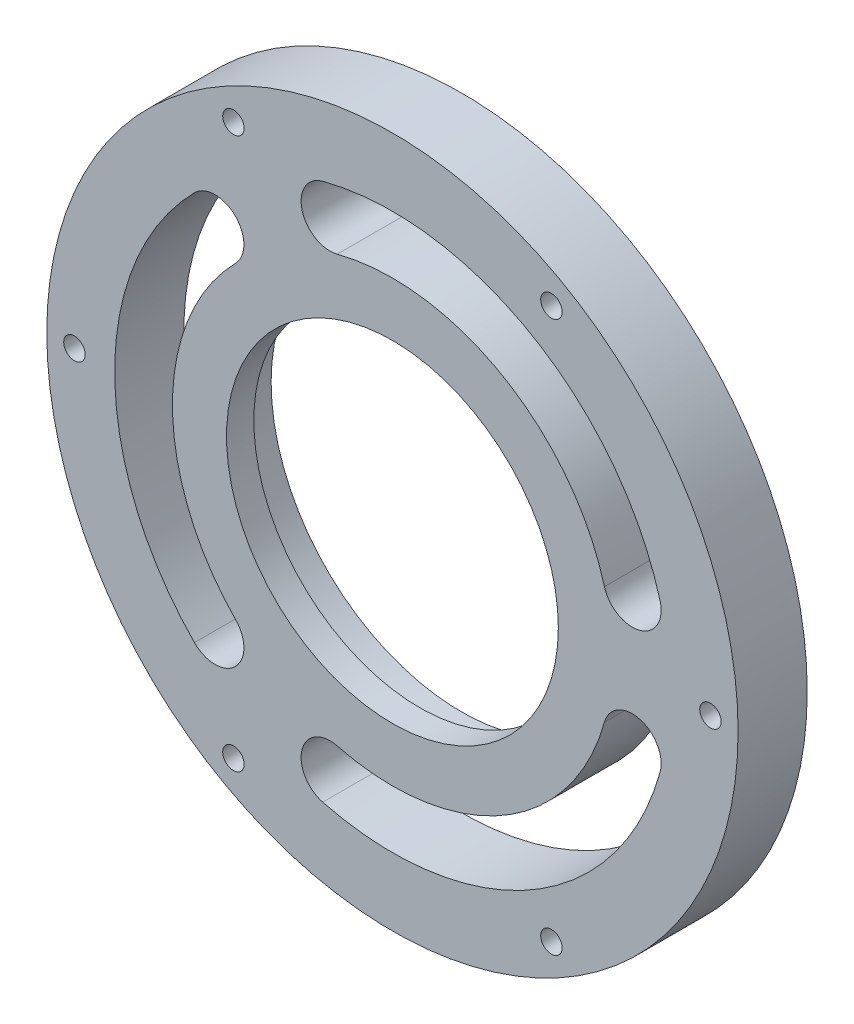
ISO-10303-21;
HEADER;
FILE_DESCRIPTION(('STEP AP214'),'2;1');
FILE_NAME('part.step','',(''),(''),'','','');
FILE_SCHEMA(('AUTOMOTIVE_DESIGN { 1 0 10303 214 1 1 1 1 }'));
ENDSEC;
DATA;
#1=APPLICATION_CONTEXT('core data for automotive mechanical design processes');
#2=APPLICATION_PROTOCOL_DEFINITION('international standard','automotive_design',2000,#1);
#3=PRODUCT_CONTEXT('',#1,'mechanical');
#4=PRODUCT('Part','Part','',(#3));
#5=PRODUCT_RELATED_PRODUCT_CATEGORY('part','',(#4));
#6=PRODUCT_DEFINITION_FORMATION('','',#4);
#7=PRODUCT_DEFINITION_CONTEXT('part definition',#1,'design');
#8=PRODUCT_DEFINITION('design','',#6,#7);
#9=PRODUCT_DEFINITION_SHAPE('','',#8);
#10=(LENGTH_UNIT() NAMED_UNIT(*) SI_UNIT(.MILLI.,.METRE.));
#11=(NAMED_UNIT(*) PLANE_ANGLE_UNIT() SI_UNIT($,.RADIAN.));
#12=(NAMED_UNIT(*) SI_UNIT($,.STERADIAN.) SOLID_ANGLE_UNIT());
#13=UNCERTAINTY_MEASURE_WITH_UNIT(LENGTH_MEASURE(1.E-05),#10,'distance_accuracy_value','');
#14=(GEOMETRIC_REPRESENTATION_CONTEXT(3) GLOBAL_UNCERTAINTY_ASSIGNED_CONTEXT((#13)) GLOBAL_UNIT_ASSIGNED_CONTEXT((#10,
#11,#12)) REPRESENTATION_CONTEXT('',''));
#15=CARTESIAN_POINT('',(0.,0.,0.));
#16=DIRECTION('',(0.,0.,1.));
#17=DIRECTION('',(1.,0.,0.));
#18=AXIS2_PLACEMENT_3D('',#15,#16,#17);
#19=CARTESIAN_POINT('',(0.,0.,0.));
#20=DIRECTION('',(0.,0.,1.));
#21=DIRECTION('',(1.,0.,0.));
#22=AXIS2_PLACEMENT_3D('',#19,#20,#21);
#23=CYLINDRICAL_SURFACE('',#22,27.55);
#24=CARTESIAN_POINT('',(0.,0.,0.));
#25=DIRECTION('',(0.,0.,1.));
#26=DIRECTION('',(1.,0.,0.));
#27=AXIS2_PLACEMENT_3D('',#24,#25,#26);
#28=CIRCLE('',#27,27.55);
#29=CARTESIAN_POINT('',(27.55,0.,0.));
#30=VERTEX_POINT('',#29);
#31=EDGE_CURVE('E232',#30,#30,#28,.T.);
#32=ORIENTED_EDGE('',*,*,#31,.F.);
#33=EDGE_LOOP('',(#32));
#34=FACE_BOUND('',#33,.T.);
#35=CARTESIAN_POINT('',(0.,0.,6.05));
#36=DIRECTION('',(0.,0.,1.));
#37=DIRECTION('',(1.,0.,0.));
#38=AXIS2_PLACEMENT_3D('',#35,#36,#37);
#39=CIRCLE('',#38,27.55);
#40=CARTESIAN_POINT('',(27.55,0.,6.05));
#41=VERTEX_POINT('',#40);
#42=EDGE_CURVE('E11',#41,#41,#39,.F.);
#43=ORIENTED_EDGE('',*,*,#42,.F.);
#44=EDGE_LOOP('',(#43));
#45=FACE_BOUND('',#44,.T.);
#46=ADVANCED_FACE('F43',(#34,#45),#23,.F.);
#47=CARTESIAN_POINT('',(0.,0.,10.));
#48=DIRECTION('',(0.,0.,1.));
#49=DIRECTION('',(1.,0.,0.));
#50=AXIS2_PLACEMENT_3D('',#47,#48,#49);
#51=PLANE('',#50);
#52=CARTESIAN_POINT('',(34.6965450819365,-9.59946661940883,10.));
#53=DIRECTION('',(0.,0.,-1.));
#54=DIRECTION('',(-1.,0.,0.));
#55=AXIS2_PLACEMENT_3D('',#52,#53,#54);
#56=CIRCLE('',#55,4.17775566612985);
#57=CARTESIAN_POINT('',(30.6700537538479,-8.48546033993495,10.));
#58=VERTEX_POINT('',#57);
#59=CARTESIAN_POINT('',(38.7230364100252,-10.7134728988827,10.));
#60=VERTEX_POINT('',#59);
#61=EDGE_CURVE('E190',#58,#60,#56,.T.);
#62=ORIENTED_EDGE('',*,*,#61,.T.);
#63=CARTESIAN_POINT('',(0.,0.,10.));
#64=DIRECTION('',(0.,0.,-1.));
#65=DIRECTION('',(-1.,0.,0.));
#66=AXIS2_PLACEMENT_3D('',#63,#64,#65);
#67=CIRCLE('',#66,40.1777556661298);
#68=CARTESIAN_POINT('',(-10.083378511824,-38.8918696921929,10.));
#69=VERTEX_POINT('',#68);
#70=EDGE_CURVE('E200',#60,#69,#67,.T.);
#71=ORIENTED_EDGE('',*,*,#70,.T.);
#72=CARTESIAN_POINT('',(-9.03489058577944,-34.8478227742135,10.));
#73=DIRECTION('',(0.,0.,-1.));
#74=DIRECTION('',(-1.,0.,0.));
#75=AXIS2_PLACEMENT_3D('',#72,#73,#74);
#76=CIRCLE('',#75,4.17775566612984);
#77=CARTESIAN_POINT('',(-7.98640265973491,-30.8037758562341,10.));
#78=VERTEX_POINT('',#77);
#79=EDGE_CURVE('E59',#69,#78,#76,.T.);
#80=ORIENTED_EDGE('',*,*,#79,.T.);
#81=CARTESIAN_POINT('',(0.,0.,10.));
#82=DIRECTION('',(0.,0.,1.));
#83=DIRECTION('',(-1.,0.,0.));
#84=AXIS2_PLACEMENT_3D('',#81,#82,#83);
#85=CIRCLE('',#84,31.8222443338702);
#86=EDGE_CURVE('E176',#78,#58,#85,.T.);
#87=ORIENTED_EDGE('',*,*,#86,.T.);
#88=EDGE_LOOP('',(#62,#71,#80,#87));
#89=FACE_BOUND('',#88,.T.);
#90=CARTESIAN_POINT('',(-25.6616544961571,-25.2483561548046,10.));
#91=DIRECTION('',(0.,0.,-1.));
#92=DIRECTION('',(-1.,0.,0.));
#93=AXIS2_PLACEMENT_3D('',#90,#91,#92);
#94=CIRCLE('',#93,4.17775566612984);
#95=CARTESIAN_POINT('',(-22.683651094113,-22.3183155162991,10.));
#96=VERTEX_POINT('',#95);
#97=CARTESIAN_POINT('',(-28.6396578982011,-28.1783967933102,10.));
#98=VERTEX_POINT('',#97);
#99=EDGE_CURVE('E137',#96,#98,#94,.T.);
#100=ORIENTED_EDGE('',*,*,#99,.T.);
#101=CARTESIAN_POINT('',(0.,0.,10.));
#102=DIRECTION('',(0.,0.,-1.));
#103=DIRECTION('',(-1.,0.,0.));
#104=AXIS2_PLACEMENT_3D('',#101,#102,#103);
#105=CIRCLE('',#104,40.1777556661298);
#106=CARTESIAN_POINT('',(-28.6396578982012,28.1783967933102,10.));
#107=VERTEX_POINT('',#106);
#108=EDGE_CURVE('E169',#98,#107,#105,.T.);
#109=ORIENTED_EDGE('',*,*,#108,.T.);
#110=CARTESIAN_POINT('',(-25.6616544961571,25.2483561548046,10.));
#111=DIRECTION('',(0.,0.,-1.));
#112=DIRECTION('',(-1.,0.,0.));
#113=AXIS2_PLACEMENT_3D('',#110,#111,#112);
#114=CIRCLE('',#113,4.17775566612984);
#115=CARTESIAN_POINT('',(-22.683651094113,22.3183155162991,10.));
#116=VERTEX_POINT('',#115);
#117=EDGE_CURVE('E66',#107,#116,#114,.T.);
#118=ORIENTED_EDGE('',*,*,#117,.T.);
#119=CARTESIAN_POINT('',(0.,0.,10.));
#120=DIRECTION('',(0.,0.,1.));
#121=DIRECTION('',(-1.,0.,0.));
#122=AXIS2_PLACEMENT_3D('',#119,#120,#121);
#123=CIRCLE('',#122,31.8222443338701);
#124=EDGE_CURVE('E164',#116,#96,#123,.T.);
#125=ORIENTED_EDGE('',*,*,#124,.T.);
#126=EDGE_LOOP('',(#100,#109,#118,#125));
#127=FACE_BOUND('',#126,.T.);
#128=CARTESIAN_POINT('',(-9.03489058577949,34.8478227742135,10.));
#129=DIRECTION('',(0.,0.,-1.));
#130=DIRECTION('',(-1.,0.,0.));
#131=AXIS2_PLACEMENT_3D('',#128,#129,#130);
#132=CIRCLE('',#131,4.17775566612985);
#133=CARTESIAN_POINT('',(-7.98640265973494,30.8037758562341,10.));
#134=VERTEX_POINT('',#133);
#135=CARTESIAN_POINT('',(-10.083378511824,38.8918696921929,10.));
#136=VERTEX_POINT('',#135);
#137=EDGE_CURVE('E205',#134,#136,#132,.T.);
#138=ORIENTED_EDGE('',*,*,#137,.T.);
#139=CARTESIAN_POINT('',(0.,0.,10.));
#140=DIRECTION('',(0.,0.,-1.));
#141=DIRECTION('',(-1.,0.,0.));
#142=AXIS2_PLACEMENT_3D('',#139,#140,#141);
#143=CIRCLE('',#142,40.1777556661298);
#144=CARTESIAN_POINT('',(38.7230364100251,10.7134728988828,10.));
#145=VERTEX_POINT('',#144);
#146=EDGE_CURVE('E204',#136,#145,#143,.T.);
#147=ORIENTED_EDGE('',*,*,#146,.T.);
#148=CARTESIAN_POINT('',(34.6965450819365,9.59946661940888,10.));
#149=DIRECTION('',(0.,0.,-1.));
#150=DIRECTION('',(-1.,0.,0.));
#151=AXIS2_PLACEMENT_3D('',#148,#149,#150);
#152=CIRCLE('',#151,4.17775566612985);
#153=CARTESIAN_POINT('',(30.6700537538479,8.48546033993499,10.));
#154=VERTEX_POINT('',#153);
#155=EDGE_CURVE('E209',#145,#154,#152,.T.);
#156=ORIENTED_EDGE('',*,*,#155,.T.);
#157=CARTESIAN_POINT('',(0.,0.,10.));
#158=DIRECTION('',(0.,0.,1.));
#159=DIRECTION('',(-1.,0.,0.));
#160=AXIS2_PLACEMENT_3D('',#157,#158,#159);
#161=CIRCLE('',#160,31.8222443338701);
#162=EDGE_CURVE('E215',#154,#134,#161,.T.);
#163=ORIENTED_EDGE('',*,*,#162,.T.);
#164=EDGE_LOOP('',(#138,#147,#156,#163));
#165=FACE_BOUND('',#164,.T.);
#166=CARTESIAN_POINT('',(-23.,39.8371685740842,10.));
#167=DIRECTION('',(0.,0.,1.));
#168=DIRECTION('',(1.,0.,0.));
#169=AXIS2_PLACEMENT_3D('',#166,#167,#168);
#170=CIRCLE('',#169,1.55);
#171=CARTESIAN_POINT('',(-21.45,39.8371685740842,10.));
#172=VERTEX_POINT('',#171);
#173=EDGE_CURVE('E250',#172,#172,#170,.T.);
#174=ORIENTED_EDGE('',*,*,#173,.F.);
#175=EDGE_LOOP('',(#174));
#176=FACE_BOUND('',#175,.T.);
#177=CARTESIAN_POINT('',(-23.,-39.8371685740842,10.));
#178=DIRECTION('',(0.,0.,1.));
#179=DIRECTION('',(1.,0.,0.));
#180=AXIS2_PLACEMENT_3D('',#177,#178,#179);
#181=CIRCLE('',#180,1.55);
#182=CARTESIAN_POINT('',(-21.45,-39.8371685740842,10.));
#183=VERTEX_POINT('',#182);
#184=EDGE_CURVE('E256',#183,#183,#181,.T.);
#185=ORIENTED_EDGE('',*,*,#184,.F.);
#186=EDGE_LOOP('',(#185));
#187=FACE_BOUND('',#186,.T.);
#188=CARTESIAN_POINT('',(46.,0.,10.));
#189=DIRECTION('',(0.,0.,1.));
#190=DIRECTION('',(1.,0.,0.));
#191=AXIS2_PLACEMENT_3D('',#188,#189,#190);
#192=CIRCLE('',#191,1.55);
#193=CARTESIAN_POINT('',(47.55,0.,10.));
#194=VERTEX_POINT('',#193);
#195=EDGE_CURVE('E272',#194,#194,#192,.T.);
#196=ORIENTED_EDGE('',*,*,#195,.F.);
#197=EDGE_LOOP('',(#196));
#198=FACE_BOUND('',#197,.T.);
#199=CARTESIAN_POINT('',(0.,0.,10.));
#200=DIRECTION('',(0.,0.,1.));
#201=DIRECTION('',(1.,0.,0.));
#202=AXIS2_PLACEMENT_3D('',#199,#200,#201);
#203=CIRCLE('',#202,50.);
#204=CARTESIAN_POINT('',(50.,0.,10.));
#205=VERTEX_POINT('',#204);
#206=EDGE_CURVE('E51',#205,#205,#203,.T.);
#207=ORIENTED_EDGE('',*,*,#206,.T.);
#208=EDGE_LOOP('',(#207));
#209=FACE_BOUND('',#208,.T.);
#210=CARTESIAN_POINT('',(23.,-39.8371685740842,10.));
#211=DIRECTION('',(0.,0.,1.));
#212=DIRECTION('',(1.,0.,0.));
#213=AXIS2_PLACEMENT_3D('',#210,#211,#212);
#214=CIRCLE('',#213,1.55);
#215=CARTESIAN_POINT('',(24.55,-39.8371685740842,10.));
#216=VERTEX_POINT('',#215);
#217=EDGE_CURVE('E264',#216,#216,#214,.T.);
#218=ORIENTED_EDGE('',*,*,#217,.F.);
#219=EDGE_LOOP('',(#218));
#220=FACE_BOUND('',#219,.T.);
#221=CARTESIAN_POINT('',(-46.,0.,10.));
#222=DIRECTION('',(0.,0.,1.));
#223=DIRECTION('',(1.,0.,0.));
#224=AXIS2_PLACEMENT_3D('',#221,#222,#223);
#225=CIRCLE('',#224,1.54999999999999);
#226=CARTESIAN_POINT('',(-44.45,0.,10.));
#227=VERTEX_POINT('',#226);
#228=EDGE_CURVE('E254',#227,#227,#225,.T.);
#229=ORIENTED_EDGE('',*,*,#228,.F.);
#230=EDGE_LOOP('',(#229));
#231=FACE_BOUND('',#230,.T.);
#232=CARTESIAN_POINT('',(23.,39.8371685740842,10.));
#233=DIRECTION('',(0.,0.,1.));
#234=DIRECTION('',(1.,0.,0.));
#235=AXIS2_PLACEMENT_3D('',#232,#233,#234);
#236=CIRCLE('',#235,1.55);
#237=CARTESIAN_POINT('',(24.55,39.8371685740842,10.));
#238=VERTEX_POINT('',#237);
#239=EDGE_CURVE('E241',#238,#238,#236,.T.);
#240=ORIENTED_EDGE('',*,*,#239,.F.);
#241=EDGE_LOOP('',(#240));
#242=FACE_BOUND('',#241,.T.);
#243=CARTESIAN_POINT('',(0.,0.,10.));
#244=DIRECTION('',(0.,0.,1.));
#245=DIRECTION('',(1.,0.,0.));
#246=AXIS2_PLACEMENT_3D('',#243,#244,#245);
#247=CIRCLE('',#246,24.);
#248=CARTESIAN_POINT('',(24.,0.,10.));
#249=VERTEX_POINT('',#248);
#250=EDGE_CURVE('E224',#249,#249,#247,.T.);
#251=ORIENTED_EDGE('',*,*,#250,.F.);
#252=EDGE_LOOP('',(#251));
#253=FACE_BOUND('',#252,.T.);
#254=ADVANCED_FACE('F282',(#89,#127,#165,#176,#187,#198,#209,#220,#231,#242,#253),#51,.T.);
#255=CARTESIAN_POINT('',(0.,0.,0.));
#256=DIRECTION('',(0.,0.,1.));
#257=DIRECTION('',(1.,0.,0.));
#258=AXIS2_PLACEMENT_3D('',#255,#256,#257);
#259=PLANE('',#258);
#260=CARTESIAN_POINT('',(0.,0.,0.));
#261=DIRECTION('',(0.,0.,-1.));
#262=DIRECTION('',(-1.,0.,0.));
#263=AXIS2_PLACEMENT_3D('',#260,#261,#262);
#264=CIRCLE('',#263,40.1777556661298);
#265=CARTESIAN_POINT('',(38.7230364100252,-10.7134728988827,0.));
#266=VERTEX_POINT('',#265);
#267=CARTESIAN_POINT('',(-10.083378511824,-38.8918696921929,0.));
#268=VERTEX_POINT('',#267);
#269=EDGE_CURVE('E188',#266,#268,#264,.T.);
#270=ORIENTED_EDGE('',*,*,#269,.F.);
#271=CARTESIAN_POINT('',(34.6965450819365,-9.59946661940883,0.));
#272=DIRECTION('',(0.,0.,-1.));
#273=DIRECTION('',(-1.,0.,0.));
#274=AXIS2_PLACEMENT_3D('',#271,#272,#273);
#275=CIRCLE('',#274,4.17775566612985);
#276=CARTESIAN_POINT('',(30.6700537538479,-8.48546033993495,0.));
#277=VERTEX_POINT('',#276);
#278=EDGE_CURVE('E141',#277,#266,#275,.T.);
#279=ORIENTED_EDGE('',*,*,#278,.F.);
#280=CARTESIAN_POINT('',(0.,0.,0.));
#281=DIRECTION('',(0.,0.,1.));
#282=DIRECTION('',(-1.,0.,0.));
#283=AXIS2_PLACEMENT_3D('',#280,#281,#282);
#284=CIRCLE('',#283,31.8222443338702);
#285=CARTESIAN_POINT('',(-7.98640265973491,-30.8037758562341,0.));
#286=VERTEX_POINT('',#285);
#287=EDGE_CURVE('E182',#286,#277,#284,.T.);
#288=ORIENTED_EDGE('',*,*,#287,.F.);
#289=CARTESIAN_POINT('',(-9.03489058577944,-34.8478227742135,0.));
#290=DIRECTION('',(0.,0.,-1.));
#291=DIRECTION('',(-1.,0.,0.));
#292=AXIS2_PLACEMENT_3D('',#289,#290,#291);
#293=CIRCLE('',#292,4.17775566612984);
#294=EDGE_CURVE('E187',#268,#286,#293,.T.);
#295=ORIENTED_EDGE('',*,*,#294,.F.);
#296=EDGE_LOOP('',(#270,#279,#288,#295));
#297=FACE_BOUND('',#296,.T.);
#298=CARTESIAN_POINT('',(0.,0.,0.));
#299=DIRECTION('',(0.,0.,-1.));
#300=DIRECTION('',(-1.,0.,0.));
#301=AXIS2_PLACEMENT_3D('',#298,#299,#300);
#302=CIRCLE('',#301,40.1777556661298);
#303=CARTESIAN_POINT('',(-28.6396578982011,-28.1783967933102,0.));
#304=VERTEX_POINT('',#303);
#305=CARTESIAN_POINT('',(-28.6396578982012,28.1783967933102,0.));
#306=VERTEX_POINT('',#305);
#307=EDGE_CURVE('E160',#304,#306,#302,.T.);
#308=ORIENTED_EDGE('',*,*,#307,.F.);
#309=CARTESIAN_POINT('',(-25.6616544961571,-25.2483561548046,0.));
#310=DIRECTION('',(0.,0.,-1.));
#311=DIRECTION('',(-1.,0.,0.));
#312=AXIS2_PLACEMENT_3D('',#309,#310,#311);
#313=CIRCLE('',#312,4.17775566612984);
#314=CARTESIAN_POINT('',(-22.683651094113,-22.3183155162991,0.));
#315=VERTEX_POINT('',#314);
#316=EDGE_CURVE('E134',#315,#304,#313,.T.);
#317=ORIENTED_EDGE('',*,*,#316,.F.);
#318=CARTESIAN_POINT('',(0.,0.,0.));
#319=DIRECTION('',(0.,0.,1.));
#320=DIRECTION('',(-1.,0.,0.));
#321=AXIS2_PLACEMENT_3D('',#318,#319,#320);
#322=CIRCLE('',#321,31.8222443338701);
#323=CARTESIAN_POINT('',(-22.683651094113,22.3183155162991,0.));
#324=VERTEX_POINT('',#323);
#325=EDGE_CURVE('E147',#324,#315,#322,.T.);
#326=ORIENTED_EDGE('',*,*,#325,.F.);
#327=CARTESIAN_POINT('',(-25.6616544961571,25.2483561548046,0.));
#328=DIRECTION('',(0.,0.,-1.));
#329=DIRECTION('',(-1.,0.,0.));
#330=AXIS2_PLACEMENT_3D('',#327,#328,#329);
#331=CIRCLE('',#330,4.17775566612984);
#332=EDGE_CURVE('E151',#306,#324,#331,.T.);
#333=ORIENTED_EDGE('',*,*,#332,.F.);
#334=EDGE_LOOP('',(#308,#317,#326,#333));
#335=FACE_BOUND('',#334,.T.);
#336=CARTESIAN_POINT('',(0.,0.,0.));
#337=DIRECTION('',(0.,0.,-1.));
#338=DIRECTION('',(-1.,0.,0.));
#339=AXIS2_PLACEMENT_3D('',#336,#337,#338);
#340=CIRCLE('',#339,40.1777556661298);
#341=CARTESIAN_POINT('',(-10.083378511824,38.8918696921929,0.));
#342=VERTEX_POINT('',#341);
#343=CARTESIAN_POINT('',(38.7230364100251,10.7134728988828,0.));
#344=VERTEX_POINT('',#343);
#345=EDGE_CURVE('E159',#342,#344,#340,.T.);
#346=ORIENTED_EDGE('',*,*,#345,.F.);
#347=CARTESIAN_POINT('',(-9.03489058577949,34.8478227742135,0.));
#348=DIRECTION('',(0.,0.,-1.));
#349=DIRECTION('',(-1.,0.,0.));
#350=AXIS2_PLACEMENT_3D('',#347,#348,#349);
#351=CIRCLE('',#350,4.17775566612985);
#352=CARTESIAN_POINT('',(-7.98640265973494,30.8037758562341,0.));
#353=VERTEX_POINT('',#352);
#354=EDGE_CURVE('E157',#353,#342,#351,.T.);
#355=ORIENTED_EDGE('',*,*,#354,.F.);
#356=CARTESIAN_POINT('',(0.,0.,0.));
#357=DIRECTION('',(0.,0.,1.));
#358=DIRECTION('',(-1.,0.,0.));
#359=AXIS2_PLACEMENT_3D('',#356,#357,#358);
#360=CIRCLE('',#359,31.8222443338701);
#361=CARTESIAN_POINT('',(30.6700537538479,8.48546033993499,0.));
#362=VERTEX_POINT('',#361);
#363=EDGE_CURVE('E207',#362,#353,#360,.T.);
#364=ORIENTED_EDGE('',*,*,#363,.F.);
#365=CARTESIAN_POINT('',(34.6965450819365,9.59946661940888,0.));
#366=DIRECTION('',(0.,0.,-1.));
#367=DIRECTION('',(-1.,0.,0.));
#368=AXIS2_PLACEMENT_3D('',#365,#366,#367);
#369=CIRCLE('',#368,4.17775566612985);
#370=EDGE_CURVE('E218',#344,#362,#369,.T.);
#371=ORIENTED_EDGE('',*,*,#370,.F.);
#372=EDGE_LOOP('',(#346,#355,#364,#371));
#373=FACE_BOUND('',#372,.T.);
#374=CARTESIAN_POINT('',(0.,0.,0.));
#375=DIRECTION('',(0.,0.,1.));
#376=DIRECTION('',(1.,0.,0.));
#377=AXIS2_PLACEMENT_3D('',#374,#375,#376);
#378=CIRCLE('',#377,50.);
#379=CARTESIAN_POINT('',(50.,0.,0.));
#380=VERTEX_POINT('',#379);
#381=EDGE_CURVE('E274',#380,#380,#378,.T.);
#382=ORIENTED_EDGE('',*,*,#381,.F.);
#383=EDGE_LOOP('',(#382));
#384=FACE_BOUND('',#383,.T.);
#385=CARTESIAN_POINT('',(46.,0.,0.));
#386=DIRECTION('',(0.,0.,1.));
#387=DIRECTION('',(1.,0.,0.));
#388=AXIS2_PLACEMENT_3D('',#385,#386,#387);
#389=CIRCLE('',#388,1.55);
#390=CARTESIAN_POINT('',(47.55,0.,0.));
#391=VERTEX_POINT('',#390);
#392=EDGE_CURVE('E267',#391,#391,#389,.T.);
#393=ORIENTED_EDGE('',*,*,#392,.T.);
#394=EDGE_LOOP('',(#393));
#395=FACE_BOUND('',#394,.T.);
#396=CARTESIAN_POINT('',(23.,-39.8371685740842,0.));
#397=DIRECTION('',(0.,0.,1.));
#398=DIRECTION('',(1.,0.,0.));
#399=AXIS2_PLACEMENT_3D('',#396,#397,#398);
#400=CIRCLE('',#399,1.55);
#401=CARTESIAN_POINT('',(24.55,-39.8371685740842,0.));
#402=VERTEX_POINT('',#401);
#403=EDGE_CURVE('E265',#402,#402,#400,.T.);
#404=ORIENTED_EDGE('',*,*,#403,.T.);
#405=EDGE_LOOP('',(#404));
#406=FACE_BOUND('',#405,.T.);
#407=CARTESIAN_POINT('',(-23.,-39.8371685740842,0.));
#408=DIRECTION('',(0.,0.,1.));
#409=DIRECTION('',(1.,0.,0.));
#410=AXIS2_PLACEMENT_3D('',#407,#408,#409);
#411=CIRCLE('',#410,1.55);
#412=CARTESIAN_POINT('',(-21.45,-39.8371685740842,0.));
#413=VERTEX_POINT('',#412);
#414=EDGE_CURVE('E257',#413,#413,#411,.T.);
#415=ORIENTED_EDGE('',*,*,#414,.T.);
#416=EDGE_LOOP('',(#415));
#417=FACE_BOUND('',#416,.T.);
#418=CARTESIAN_POINT('',(-46.,0.,0.));
#419=DIRECTION('',(0.,0.,1.));
#420=DIRECTION('',(1.,0.,0.));
#421=AXIS2_PLACEMENT_3D('',#418,#419,#420);
#422=CIRCLE('',#421,1.54999999999999);
#423=CARTESIAN_POINT('',(-44.45,0.,0.));
#424=VERTEX_POINT('',#423);
#425=EDGE_CURVE('E249',#424,#424,#422,.T.);
#426=ORIENTED_EDGE('',*,*,#425,.T.);
#427=EDGE_LOOP('',(#426));
#428=FACE_BOUND('',#427,.T.);
#429=CARTESIAN_POINT('',(-23.,39.8371685740842,0.));
#430=DIRECTION('',(0.,0.,1.));
#431=DIRECTION('',(1.,0.,0.));
#432=AXIS2_PLACEMENT_3D('',#429,#430,#431);
#433=CIRCLE('',#432,1.55);
#434=CARTESIAN_POINT('',(-21.45,39.8371685740842,0.));
#435=VERTEX_POINT('',#434);
#436=EDGE_CURVE('E242',#435,#435,#433,.T.);
#437=ORIENTED_EDGE('',*,*,#436,.T.);
#438=EDGE_LOOP('',(#437));
#439=FACE_BOUND('',#438,.T.);
#440=CARTESIAN_POINT('',(23.,39.8371685740842,0.));
#441=DIRECTION('',(0.,0.,1.));
#442=DIRECTION('',(1.,0.,0.));
#443=AXIS2_PLACEMENT_3D('',#440,#441,#442);
#444=CIRCLE('',#443,1.55);
#445=CARTESIAN_POINT('',(24.55,39.8371685740842,0.));
#446=VERTEX_POINT('',#445);
#447=EDGE_CURVE('E239',#446,#446,#444,.T.);
#448=ORIENTED_EDGE('',*,*,#447,.T.);
#449=EDGE_LOOP('',(#448));
#450=FACE_BOUND('',#449,.T.);
#451=ORIENTED_EDGE('',*,*,#31,.T.);
#452=EDGE_LOOP('',(#451));
#453=FACE_BOUND('',#452,.T.);
#454=ADVANCED_FACE('F152',(#297,#335,#373,#384,#395,#406,#417,#428,#439,#450,#453),#259,.F.);
#455=CARTESIAN_POINT('',(0.,0.,10.));
#456=DIRECTION('',(0.,0.,-1.));
#457=DIRECTION('',(-1.,0.,0.));
#458=AXIS2_PLACEMENT_3D('',#455,#456,#457);
#459=CYLINDRICAL_SURFACE('',#458,50.);
#460=ORIENTED_EDGE('',*,*,#206,.F.);
#461=EDGE_LOOP('',(#460));
#462=FACE_BOUND('',#461,.T.);
#463=ORIENTED_EDGE('',*,*,#381,.T.);
#464=EDGE_LOOP('',(#463));
#465=FACE_BOUND('',#464,.T.);
#466=ADVANCED_FACE('F44',(#462,#465),#459,.T.);
#467=CARTESIAN_POINT('',(46.,0.,10.));
#468=DIRECTION('',(0.,0.,-1.));
#469=DIRECTION('',(-1.,0.,0.));
#470=AXIS2_PLACEMENT_3D('',#467,#468,#469);
#471=CYLINDRICAL_SURFACE('',#470,1.55);
#472=ORIENTED_EDGE('',*,*,#195,.T.);
#473=EDGE_LOOP('',(#472));
#474=FACE_BOUND('',#473,.T.);
#475=ORIENTED_EDGE('',*,*,#392,.F.);
#476=EDGE_LOOP('',(#475));
#477=FACE_BOUND('',#476,.T.);
#478=ADVANCED_FACE('F340',(#474,#477),#471,.F.);
#479=CARTESIAN_POINT('',(23.,-39.8371685740842,10.));
#480=DIRECTION('',(0.,0.,-1.));
#481=DIRECTION('',(-1.,0.,0.));
#482=AXIS2_PLACEMENT_3D('',#479,#480,#481);
#483=CYLINDRICAL_SURFACE('',#482,1.55);
#484=ORIENTED_EDGE('',*,*,#217,.T.);
#485=EDGE_LOOP('',(#484));
#486=FACE_BOUND('',#485,.T.);
#487=ORIENTED_EDGE('',*,*,#403,.F.);
#488=EDGE_LOOP('',(#487));
#489=FACE_BOUND('',#488,.T.);
#490=ADVANCED_FACE('F332',(#486,#489),#483,.F.);
#491=CARTESIAN_POINT('',(-23.,-39.8371685740842,10.));
#492=DIRECTION('',(0.,0.,-1.));
#493=DIRECTION('',(-1.,0.,0.));
#494=AXIS2_PLACEMENT_3D('',#491,#492,#493);
#495=CYLINDRICAL_SURFACE('',#494,1.55);
#496=ORIENTED_EDGE('',*,*,#184,.T.);
#497=EDGE_LOOP('',(#496));
#498=FACE_BOUND('',#497,.T.);
#499=ORIENTED_EDGE('',*,*,#414,.F.);
#500=EDGE_LOOP('',(#499));
#501=FACE_BOUND('',#500,.T.);
#502=ADVANCED_FACE('F327',(#498,#501),#495,.F.);
#503=CARTESIAN_POINT('',(-46.,0.,10.));
#504=DIRECTION('',(0.,0.,-1.));
#505=DIRECTION('',(-1.,0.,0.));
#506=AXIS2_PLACEMENT_3D('',#503,#504,#505);
#507=CYLINDRICAL_SURFACE('',#506,1.54999999999999);
#508=ORIENTED_EDGE('',*,*,#228,.T.);
#509=EDGE_LOOP('',(#508));
#510=FACE_BOUND('',#509,.T.);
#511=ORIENTED_EDGE('',*,*,#425,.F.);
#512=EDGE_LOOP('',(#511));
#513=FACE_BOUND('',#512,.T.);
#514=ADVANCED_FACE('F323',(#510,#513),#507,.F.);
#515=CARTESIAN_POINT('',(-23.,39.8371685740842,10.));
#516=DIRECTION('',(0.,0.,-1.));
#517=DIRECTION('',(-1.,0.,0.));
#518=AXIS2_PLACEMENT_3D('',#515,#516,#517);
#519=CYLINDRICAL_SURFACE('',#518,1.55);
#520=ORIENTED_EDGE('',*,*,#173,.T.);
#521=EDGE_LOOP('',(#520));
#522=FACE_BOUND('',#521,.T.);
#523=ORIENTED_EDGE('',*,*,#436,.F.);
#524=EDGE_LOOP('',(#523));
#525=FACE_BOUND('',#524,.T.);
#526=ADVANCED_FACE('F319',(#522,#525),#519,.F.);
#527=CARTESIAN_POINT('',(23.,39.8371685740842,10.));
#528=DIRECTION('',(0.,0.,-1.));
#529=DIRECTION('',(-1.,0.,0.));
#530=AXIS2_PLACEMENT_3D('',#527,#528,#529);
#531=CYLINDRICAL_SURFACE('',#530,1.55);
#532=ORIENTED_EDGE('',*,*,#239,.T.);
#533=EDGE_LOOP('',(#532));
#534=FACE_BOUND('',#533,.T.);
#535=ORIENTED_EDGE('',*,*,#447,.F.);
#536=EDGE_LOOP('',(#535));
#537=FACE_BOUND('',#536,.T.);
#538=ADVANCED_FACE('F308',(#534,#537),#531,.F.);
#539=CARTESIAN_POINT('',(0.,0.,6.05));
#540=DIRECTION('',(0.,0.,1.));
#541=DIRECTION('',(1.,0.,0.));
#542=AXIS2_PLACEMENT_3D('',#539,#540,#541);
#543=PLANE('',#542);
#544=CARTESIAN_POINT('',(0.,0.,6.05));
#545=DIRECTION('',(0.,0.,1.));
#546=DIRECTION('',(1.,0.,0.));
#547=AXIS2_PLACEMENT_3D('',#544,#545,#546);
#548=CIRCLE('',#547,24.);
#549=CARTESIAN_POINT('',(24.,0.,6.05));
#550=VERTEX_POINT('',#549);
#551=EDGE_CURVE('E235',#550,#550,#548,.T.);
#552=ORIENTED_EDGE('',*,*,#551,.T.);
#553=EDGE_LOOP('',(#552));
#554=FACE_BOUND('',#553,.T.);
#555=ORIENTED_EDGE('',*,*,#42,.T.);
#556=EDGE_LOOP('',(#555));
#557=FACE_BOUND('',#556,.T.);
#558=ADVANCED_FACE('F304',(#554,#557),#543,.F.);
#559=CARTESIAN_POINT('',(0.,0.,6.05));
#560=DIRECTION('',(0.,0.,1.));
#561=DIRECTION('',(1.,0.,0.));
#562=AXIS2_PLACEMENT_3D('',#559,#560,#561);
#563=CYLINDRICAL_SURFACE('',#562,24.);
#564=ORIENTED_EDGE('',*,*,#551,.F.);
#565=EDGE_LOOP('',(#564));
#566=FACE_BOUND('',#565,.T.);
#567=ORIENTED_EDGE('',*,*,#250,.T.);
#568=EDGE_LOOP('',(#567));
#569=FACE_BOUND('',#568,.T.);
#570=ADVANCED_FACE('F310',(#566,#569),#563,.F.);
#571=CARTESIAN_POINT('',(-9.03489058577949,34.8478227742135,10.));
#572=DIRECTION('',(0.,0.,-1.));
#573=DIRECTION('',(-1.,0.,0.));
#574=AXIS2_PLACEMENT_3D('',#571,#572,#573);
#575=CYLINDRICAL_SURFACE('',#574,4.17775566612985);
#576=ORIENTED_EDGE('',*,*,#354,.T.);
#577=DIRECTION('',(0.,0.,-1.));
#578=VECTOR('',#577,1.);
#579=CARTESIAN_POINT('',(-10.083378511824,38.8918696921929,10.));
#580=LINE('',#579,#578);
#581=EDGE_CURVE('E211',#136,#342,#580,.T.);
#582=ORIENTED_EDGE('',*,*,#581,.F.);
#583=ORIENTED_EDGE('',*,*,#137,.F.);
#584=DIRECTION('',(0.,0.,-1.));
#585=VECTOR('',#584,1.);
#586=CARTESIAN_POINT('',(-7.98640265973494,30.8037758562341,10.));
#587=LINE('',#586,#585);
#588=EDGE_CURVE('E222',#134,#353,#587,.T.);
#589=ORIENTED_EDGE('',*,*,#588,.T.);
#590=EDGE_LOOP('',(#576,#582,#583,#589));
#591=FACE_BOUND('',#590,.T.);
#592=ADVANCED_FACE('F313',(#591),#575,.F.);
#593=CARTESIAN_POINT('',(0.,0.,10.));
#594=DIRECTION('',(0.,0.,-1.));
#595=DIRECTION('',(-1.,0.,0.));
#596=AXIS2_PLACEMENT_3D('',#593,#594,#595);
#597=CYLINDRICAL_SURFACE('',#596,31.8222443338701);
#598=ORIENTED_EDGE('',*,*,#363,.T.);
#599=ORIENTED_EDGE('',*,*,#588,.F.);
#600=ORIENTED_EDGE('',*,*,#162,.F.);
#601=DIRECTION('',(0.,0.,-1.));
#602=VECTOR('',#601,1.);
#603=CARTESIAN_POINT('',(30.6700537538479,8.48546033993499,10.));
#604=LINE('',#603,#602);
#605=EDGE_CURVE('E228',#154,#362,#604,.T.);
#606=ORIENTED_EDGE('',*,*,#605,.T.);
#607=EDGE_LOOP('',(#598,#599,#600,#606));
#608=FACE_BOUND('',#607,.T.);
#609=ADVANCED_FACE('F431',(#608),#597,.T.);
#610=CARTESIAN_POINT('',(34.6965450819365,9.59946661940888,10.));
#611=DIRECTION('',(0.,0.,-1.));
#612=DIRECTION('',(-1.,0.,0.));
#613=AXIS2_PLACEMENT_3D('',#610,#611,#612);
#614=CYLINDRICAL_SURFACE('',#613,4.17775566612985);
#615=ORIENTED_EDGE('',*,*,#370,.T.);
#616=ORIENTED_EDGE('',*,*,#605,.F.);
#617=ORIENTED_EDGE('',*,*,#155,.F.);
#618=DIRECTION('',(0.,0.,-1.));
#619=VECTOR('',#618,1.);
#620=CARTESIAN_POINT('',(38.7230364100251,10.7134728988828,10.));
#621=LINE('',#620,#619);
#622=EDGE_CURVE('E226',#145,#344,#621,.T.);
#623=ORIENTED_EDGE('',*,*,#622,.T.);
#624=EDGE_LOOP('',(#615,#616,#617,#623));
#625=FACE_BOUND('',#624,.T.);
#626=ADVANCED_FACE('F437',(#625),#614,.F.);
#627=CARTESIAN_POINT('',(0.,0.,10.));
#628=DIRECTION('',(0.,0.,-1.));
#629=DIRECTION('',(-1.,0.,0.));
#630=AXIS2_PLACEMENT_3D('',#627,#628,#629);
#631=CYLINDRICAL_SURFACE('',#630,40.1777556661298);
#632=ORIENTED_EDGE('',*,*,#345,.T.);
#633=ORIENTED_EDGE('',*,*,#622,.F.);
#634=ORIENTED_EDGE('',*,*,#146,.F.);
#635=ORIENTED_EDGE('',*,*,#581,.T.);
#636=EDGE_LOOP('',(#632,#633,#634,#635));
#637=FACE_BOUND('',#636,.T.);
#638=ADVANCED_FACE('F449',(#637),#631,.F.);
#639=CARTESIAN_POINT('',(-25.6616544961571,-25.2483561548046,10.));
#640=DIRECTION('',(0.,0.,-1.));
#641=DIRECTION('',(-1.,0.,0.));
#642=AXIS2_PLACEMENT_3D('',#639,#640,#641);
#643=CYLINDRICAL_SURFACE('',#642,4.17775566612984);
#644=ORIENTED_EDGE('',*,*,#316,.T.);
#645=DIRECTION('',(0.,0.,-1.));
#646=VECTOR('',#645,1.);
#647=CARTESIAN_POINT('',(-28.6396578982011,-28.1783967933102,10.));
#648=LINE('',#647,#646);
#649=EDGE_CURVE('E170',#98,#304,#648,.T.);
#650=ORIENTED_EDGE('',*,*,#649,.F.);
#651=ORIENTED_EDGE('',*,*,#99,.F.);
#652=DIRECTION('',(0.,0.,-1.));
#653=VECTOR('',#652,1.);
#654=CARTESIAN_POINT('',(-22.683651094113,-22.3183155162991,10.));
#655=LINE('',#654,#653);
#656=EDGE_CURVE('E131',#96,#315,#655,.T.);
#657=ORIENTED_EDGE('',*,*,#656,.T.);
#658=EDGE_LOOP('',(#644,#650,#651,#657));
#659=FACE_BOUND('',#658,.T.);
#660=ADVANCED_FACE('F133',(#659),#643,.F.);
#661=CARTESIAN_POINT('',(0.,0.,10.));
#662=DIRECTION('',(0.,0.,-1.));
#663=DIRECTION('',(-1.,0.,0.));
#664=AXIS2_PLACEMENT_3D('',#661,#662,#663);
#665=CYLINDRICAL_SURFACE('',#664,31.8222443338701);
#666=ORIENTED_EDGE('',*,*,#325,.T.);
#667=ORIENTED_EDGE('',*,*,#656,.F.);
#668=ORIENTED_EDGE('',*,*,#124,.F.);
#669=DIRECTION('',(0.,0.,-1.));
#670=VECTOR('',#669,1.);
#671=CARTESIAN_POINT('',(-22.683651094113,22.3183155162991,10.));
#672=LINE('',#671,#670);
#673=EDGE_CURVE('E145',#116,#324,#672,.T.);
#674=ORIENTED_EDGE('',*,*,#673,.T.);
#675=EDGE_LOOP('',(#666,#667,#668,#674));
#676=FACE_BOUND('',#675,.T.);
#677=ADVANCED_FACE('F150',(#676),#665,.T.);
#678=CARTESIAN_POINT('',(-25.6616544961571,25.2483561548046,10.));
#679=DIRECTION('',(0.,0.,-1.));
#680=DIRECTION('',(-1.,0.,0.));
#681=AXIS2_PLACEMENT_3D('',#678,#679,#680);
#682=CYLINDRICAL_SURFACE('',#681,4.17775566612984);
#683=ORIENTED_EDGE('',*,*,#332,.T.);
#684=ORIENTED_EDGE('',*,*,#673,.F.);
#685=ORIENTED_EDGE('',*,*,#117,.F.);
#686=DIRECTION('',(0.,0.,-1.));
#687=VECTOR('',#686,1.);
#688=CARTESIAN_POINT('',(-28.6396578982012,28.1783967933102,10.));
#689=LINE('',#688,#687);
#690=EDGE_CURVE('E570',#107,#306,#689,.T.);
#691=ORIENTED_EDGE('',*,*,#690,.T.);
#692=EDGE_LOOP('',(#683,#684,#685,#691));
#693=FACE_BOUND('',#692,.T.);
#694=ADVANCED_FACE('F475',(#693),#682,.F.);
#695=CARTESIAN_POINT('',(0.,0.,10.));
#696=DIRECTION('',(0.,0.,-1.));
#697=DIRECTION('',(-1.,0.,0.));
#698=AXIS2_PLACEMENT_3D('',#695,#696,#697);
#699=CYLINDRICAL_SURFACE('',#698,40.1777556661298);
#700=ORIENTED_EDGE('',*,*,#307,.T.);
#701=ORIENTED_EDGE('',*,*,#690,.F.);
#702=ORIENTED_EDGE('',*,*,#108,.F.);
#703=ORIENTED_EDGE('',*,*,#649,.T.);
#704=EDGE_LOOP('',(#700,#701,#702,#703));
#705=FACE_BOUND('',#704,.T.);
#706=ADVANCED_FACE('F479',(#705),#699,.F.);
#707=CARTESIAN_POINT('',(34.6965450819365,-9.59946661940883,10.));
#708=DIRECTION('',(0.,0.,-1.));
#709=DIRECTION('',(-1.,0.,0.));
#710=AXIS2_PLACEMENT_3D('',#707,#708,#709);
#711=CYLINDRICAL_SURFACE('',#710,4.17775566612985);
#712=ORIENTED_EDGE('',*,*,#278,.T.);
#713=DIRECTION('',(0.,0.,-1.));
#714=VECTOR('',#713,1.);
#715=CARTESIAN_POINT('',(38.7230364100252,-10.7134728988827,10.));
#716=LINE('',#715,#714);
#717=EDGE_CURVE('E173',#60,#266,#716,.T.);
#718=ORIENTED_EDGE('',*,*,#717,.F.);
#719=ORIENTED_EDGE('',*,*,#61,.F.);
#720=DIRECTION('',(0.,0.,-1.));
#721=VECTOR('',#720,1.);
#722=CARTESIAN_POINT('',(30.6700537538479,-8.48546033993495,10.));
#723=LINE('',#722,#721);
#724=EDGE_CURVE('E181',#58,#277,#723,.T.);
#725=ORIENTED_EDGE('',*,*,#724,.T.);
#726=EDGE_LOOP('',(#712,#718,#719,#725));
#727=FACE_BOUND('',#726,.T.);
#728=ADVANCED_FACE('F486',(#727),#711,.F.);
#729=CARTESIAN_POINT('',(0.,0.,10.));
#730=DIRECTION('',(0.,0.,-1.));
#731=DIRECTION('',(-1.,0.,0.));
#732=AXIS2_PLACEMENT_3D('',#729,#730,#731);
#733=CYLINDRICAL_SURFACE('',#732,31.8222443338702);
#734=ORIENTED_EDGE('',*,*,#287,.T.);
#735=ORIENTED_EDGE('',*,*,#724,.F.);
#736=ORIENTED_EDGE('',*,*,#86,.F.);
#737=DIRECTION('',(0.,0.,-1.));
#738=VECTOR('',#737,1.);
#739=CARTESIAN_POINT('',(-7.98640265973491,-30.8037758562341,10.));
#740=LINE('',#739,#738);
#741=EDGE_CURVE('E177',#78,#286,#740,.T.);
#742=ORIENTED_EDGE('',*,*,#741,.T.);
#743=EDGE_LOOP('',(#734,#735,#736,#742));
#744=FACE_BOUND('',#743,.T.);
#745=ADVANCED_FACE('F500',(#744),#733,.T.);
#746=CARTESIAN_POINT('',(-9.03489058577944,-34.8478227742135,10.));
#747=DIRECTION('',(0.,0.,-1.));
#748=DIRECTION('',(-1.,0.,0.));
#749=AXIS2_PLACEMENT_3D('',#746,#747,#748);
#750=CYLINDRICAL_SURFACE('',#749,4.17775566612984);
#751=ORIENTED_EDGE('',*,*,#294,.T.);
#752=ORIENTED_EDGE('',*,*,#741,.F.);
#753=ORIENTED_EDGE('',*,*,#79,.F.);
#754=DIRECTION('',(0.,0.,-1.));
#755=VECTOR('',#754,1.);
#756=CARTESIAN_POINT('',(-10.083378511824,-38.8918696921929,10.));
#757=LINE('',#756,#755);
#758=EDGE_CURVE('E180',#69,#268,#757,.T.);
#759=ORIENTED_EDGE('',*,*,#758,.T.);
#760=EDGE_LOOP('',(#751,#752,#753,#759));
#761=FACE_BOUND('',#760,.T.);
#762=ADVANCED_FACE('F506',(#761),#750,.F.);
#763=CARTESIAN_POINT('',(0.,0.,10.));
#764=DIRECTION('',(0.,0.,-1.));
#765=DIRECTION('',(-1.,0.,0.));
#766=AXIS2_PLACEMENT_3D('',#763,#764,#765);
#767=CYLINDRICAL_SURFACE('',#766,40.1777556661298);
#768=ORIENTED_EDGE('',*,*,#269,.T.);
#769=ORIENTED_EDGE('',*,*,#758,.F.);
#770=ORIENTED_EDGE('',*,*,#70,.F.);
#771=ORIENTED_EDGE('',*,*,#717,.T.);
#772=EDGE_LOOP('',(#768,#769,#770,#771));
#773=FACE_BOUND('',#772,.T.);
#774=ADVANCED_FACE('F513',(#773),#767,.F.);
#775=CLOSED_SHELL('',(#46,#254,#454,#466,#478,#490,#502,#514,#526,#538,#558,#570,#592,#609,#626,
#638,#660,#677,#694,#706,#728,#745,#762,#774));
#776=MANIFOLD_SOLID_BREP('B2',#775);
#777=ADVANCED_BREP_SHAPE_REPRESENTATION('',(#18,#776),#14);
#778=SHAPE_DEFINITION_REPRESENTATION(#9,#777);
ENDSEC;
END-ISO-10303-21;
